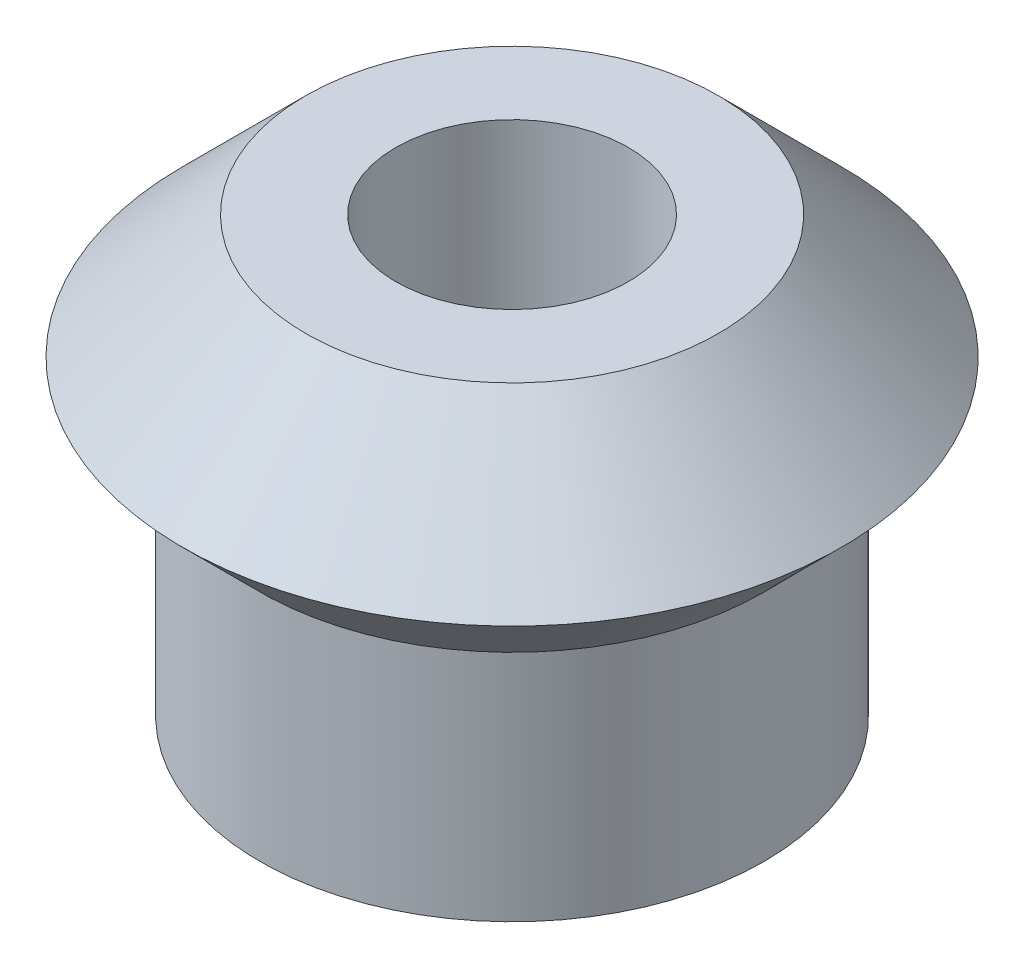
ISO-10303-21;
HEADER;
FILE_DESCRIPTION(('STEP AP214'),'2;1');
FILE_NAME('part.step','',(''),(''),'','','');
FILE_SCHEMA(('AUTOMOTIVE_DESIGN { 1 0 10303 214 1 1 1 1 }'));
ENDSEC;
DATA;
#1=APPLICATION_CONTEXT('core data for automotive mechanical design processes');
#2=APPLICATION_PROTOCOL_DEFINITION('international standard','automotive_design',2000,#1);
#3=PRODUCT_CONTEXT('',#1,'mechanical');
#4=PRODUCT('Part','Part','',(#3));
#5=PRODUCT_RELATED_PRODUCT_CATEGORY('part','',(#4));
#6=PRODUCT_DEFINITION_FORMATION('','',#4);
#7=PRODUCT_DEFINITION_CONTEXT('part definition',#1,'design');
#8=PRODUCT_DEFINITION('design','',#6,#7);
#9=PRODUCT_DEFINITION_SHAPE('','',#8);
#10=(LENGTH_UNIT() NAMED_UNIT(*) SI_UNIT(.MILLI.,.METRE.));
#11=(NAMED_UNIT(*) PLANE_ANGLE_UNIT() SI_UNIT($,.RADIAN.));
#12=(NAMED_UNIT(*) SI_UNIT($,.STERADIAN.) SOLID_ANGLE_UNIT());
#13=UNCERTAINTY_MEASURE_WITH_UNIT(LENGTH_MEASURE(1.E-05),#10,'distance_accuracy_value','');
#14=(GEOMETRIC_REPRESENTATION_CONTEXT(3) GLOBAL_UNCERTAINTY_ASSIGNED_CONTEXT((#13)) GLOBAL_UNIT_ASSIGNED_CONTEXT((#10,
#11,#12)) REPRESENTATION_CONTEXT('',''));
#15=CARTESIAN_POINT('',(0.,0.,0.));
#16=DIRECTION('',(0.,0.,1.));
#17=DIRECTION('',(1.,0.,0.));
#18=AXIS2_PLACEMENT_3D('',#15,#16,#17);
#19=CARTESIAN_POINT('',(0.,0.,0.));
#20=DIRECTION('',(0.,-1.,0.));
#21=DIRECTION('',(1.,0.,0.));
#22=AXIS2_PLACEMENT_3D('',#19,#20,#21);
#23=PLANE('',#22);
#24=CARTESIAN_POINT('',(0.,0.,0.));
#25=DIRECTION('',(0.,1.,0.));
#26=DIRECTION('',(-1.,0.,0.));
#27=AXIS2_PLACEMENT_3D('',#24,#25,#26);
#28=CIRCLE('',#27,3.);
#29=CARTESIAN_POINT('',(-3.,0.,0.));
#30=VERTEX_POINT('',#29);
#31=EDGE_CURVE('E50',#30,#30,#28,.T.);
#32=ORIENTED_EDGE('',*,*,#31,.T.);
#33=EDGE_LOOP('',(#32));
#34=FACE_BOUND('',#33,.T.);
#35=CARTESIAN_POINT('',(0.,0.,0.));
#36=DIRECTION('',(0.,1.,0.));
#37=DIRECTION('',(-1.,0.,0.));
#38=AXIS2_PLACEMENT_3D('',#35,#36,#37);
#39=CIRCLE('',#38,6.5);
#40=CARTESIAN_POINT('',(-6.5,0.,0.));
#41=VERTEX_POINT('',#40);
#42=EDGE_CURVE('E10',#41,#41,#39,.T.);
#43=ORIENTED_EDGE('',*,*,#42,.F.);
#44=EDGE_LOOP('',(#43));
#45=FACE_BOUND('',#44,.T.);
#46=ADVANCED_FACE('F31',(#34,#45),#23,.T.);
#47=CARTESIAN_POINT('',(0.,11.2,0.));
#48=DIRECTION('',(0.,1.,0.));
#49=DIRECTION('',(-1.,0.,0.));
#50=AXIS2_PLACEMENT_3D('',#47,#48,#49);
#51=CYLINDRICAL_SURFACE('',#50,6.5);
#52=ORIENTED_EDGE('',*,*,#42,.T.);
#53=EDGE_LOOP('',(#52));
#54=FACE_BOUND('',#53,.T.);
#55=CARTESIAN_POINT('',(0.,6.01801948466053,0.));
#56=DIRECTION('',(0.,1.,0.));
#57=DIRECTION('',(-1.,0.,0.));
#58=AXIS2_PLACEMENT_3D('',#55,#56,#57);
#59=CIRCLE('',#58,6.5);
#60=CARTESIAN_POINT('',(-6.5,6.01801948466053,0.));
#61=VERTEX_POINT('',#60);
#62=EDGE_CURVE('E37',#61,#61,#59,.T.);
#63=ORIENTED_EDGE('',*,*,#62,.F.);
#64=EDGE_LOOP('',(#63));
#65=FACE_BOUND('',#64,.T.);
#66=ADVANCED_FACE('F79',(#54,#65),#51,.T.);
#67=CARTESIAN_POINT('',(0.,8.01801948466055,0.));
#68=DIRECTION('',(0.,1.,0.));
#69=DIRECTION('',(-1.,0.,0.));
#70=AXIS2_PLACEMENT_3D('',#67,#68,#69);
#71=CONICAL_SURFACE('',#70,8.50000000000001,0.785398163397444);
#72=ORIENTED_EDGE('',*,*,#62,.T.);
#73=EDGE_LOOP('',(#72));
#74=FACE_BOUND('',#73,.T.);
#75=CARTESIAN_POINT('',(0.,8.01801948466055,0.));
#76=DIRECTION('',(0.,1.,0.));
#77=DIRECTION('',(-1.,0.,0.));
#78=AXIS2_PLACEMENT_3D('',#75,#76,#77);
#79=CIRCLE('',#78,8.50000000000001);
#80=CARTESIAN_POINT('',(-8.5,8.01801948466055,0.));
#81=VERTEX_POINT('',#80);
#82=EDGE_CURVE('E41',#81,#81,#79,.T.);
#83=ORIENTED_EDGE('',*,*,#82,.F.);
#84=EDGE_LOOP('',(#83));
#85=FACE_BOUND('',#84,.T.);
#86=ADVANCED_FACE('F73',(#74,#85),#71,.T.);
#87=CARTESIAN_POINT('',(0.,11.2,0.));
#88=DIRECTION('',(0.,-1.,0.));
#89=DIRECTION('',(1.,0.,0.));
#90=AXIS2_PLACEMENT_3D('',#87,#88,#89);
#91=CONICAL_SURFACE('',#90,5.31801948466053,0.785398163397453);
#92=ORIENTED_EDGE('',*,*,#82,.T.);
#93=EDGE_LOOP('',(#92));
#94=FACE_BOUND('',#93,.T.);
#95=CARTESIAN_POINT('',(0.,11.2,0.));
#96=DIRECTION('',(0.,1.,0.));
#97=DIRECTION('',(-1.,0.,0.));
#98=AXIS2_PLACEMENT_3D('',#95,#96,#97);
#99=CIRCLE('',#98,5.31801948466053);
#100=CARTESIAN_POINT('',(-5.31801948466052,11.2,0.));
#101=VERTEX_POINT('',#100);
#102=EDGE_CURVE('E45',#101,#101,#99,.T.);
#103=ORIENTED_EDGE('',*,*,#102,.F.);
#104=EDGE_LOOP('',(#103));
#105=FACE_BOUND('',#104,.T.);
#106=ADVANCED_FACE('F68',(#94,#105),#91,.T.);
#107=CARTESIAN_POINT('',(-5.31801948466052,11.2,0.));
#108=DIRECTION('',(0.,1.,0.));
#109=DIRECTION('',(-1.,0.,0.));
#110=AXIS2_PLACEMENT_3D('',#107,#108,#109);
#111=PLANE('',#110);
#112=CARTESIAN_POINT('',(0.,11.2,0.));
#113=DIRECTION('',(0.,1.,0.));
#114=DIRECTION('',(-1.,0.,0.));
#115=AXIS2_PLACEMENT_3D('',#112,#113,#114);
#116=CIRCLE('',#115,3.);
#117=CARTESIAN_POINT('',(-2.99999999999999,11.2,0.));
#118=VERTEX_POINT('',#117);
#119=EDGE_CURVE('E51',#118,#118,#116,.T.);
#120=ORIENTED_EDGE('',*,*,#119,.F.);
#121=EDGE_LOOP('',(#120));
#122=FACE_BOUND('',#121,.T.);
#123=ORIENTED_EDGE('',*,*,#102,.T.);
#124=EDGE_LOOP('',(#123));
#125=FACE_BOUND('',#124,.T.);
#126=ADVANCED_FACE('F62',(#122,#125),#111,.T.);
#127=CARTESIAN_POINT('',(0.,0.,0.));
#128=DIRECTION('',(0.,1.,0.));
#129=DIRECTION('',(-1.,0.,0.));
#130=AXIS2_PLACEMENT_3D('',#127,#128,#129);
#131=CYLINDRICAL_SURFACE('',#130,3.);
#132=ORIENTED_EDGE('',*,*,#31,.F.);
#133=EDGE_LOOP('',(#132));
#134=FACE_BOUND('',#133,.T.);
#135=ORIENTED_EDGE('',*,*,#119,.T.);
#136=EDGE_LOOP('',(#135));
#137=FACE_BOUND('',#136,.T.);
#138=ADVANCED_FACE('F59',(#134,#137),#131,.F.);
#139=CLOSED_SHELL('',(#46,#66,#86,#106,#126,#138));
#140=MANIFOLD_SOLID_BREP('B2',#139);
#141=ADVANCED_BREP_SHAPE_REPRESENTATION('',(#18,#140),#14);
#142=SHAPE_DEFINITION_REPRESENTATION(#9,#141);
ENDSEC;
END-ISO-10303-21;
